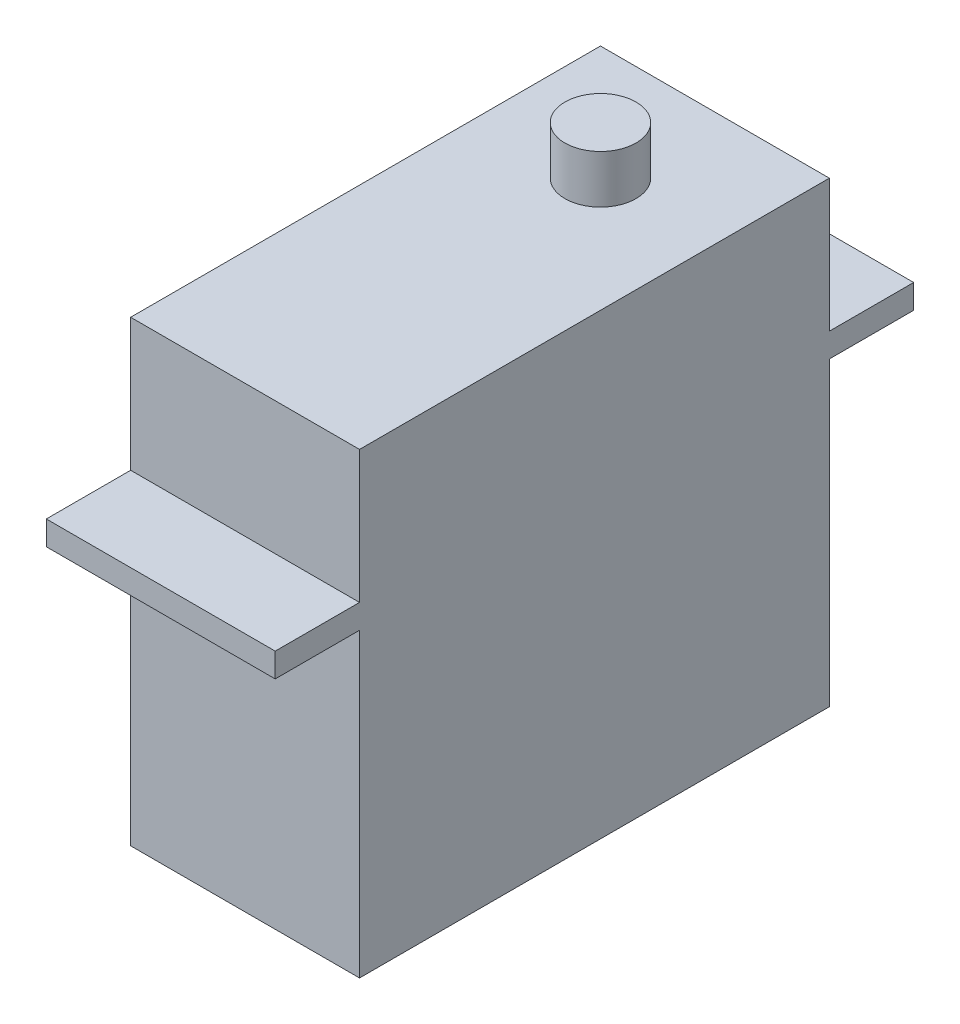
ISO-10303-21;
HEADER;
FILE_DESCRIPTION(('STEP AP214'),'2;1');
FILE_NAME('part.step','',(''),(''),'','','');
FILE_SCHEMA(('AUTOMOTIVE_DESIGN { 1 0 10303 214 1 1 1 1 }'));
ENDSEC;
DATA;
#1=APPLICATION_CONTEXT('core data for automotive mechanical design processes');
#2=APPLICATION_PROTOCOL_DEFINITION('international standard','automotive_design',2000,#1);
#3=PRODUCT_CONTEXT('',#1,'mechanical');
#4=PRODUCT('Part','Part','',(#3));
#5=PRODUCT_RELATED_PRODUCT_CATEGORY('part','',(#4));
#6=PRODUCT_DEFINITION_FORMATION('','',#4);
#7=PRODUCT_DEFINITION_CONTEXT('part definition',#1,'design');
#8=PRODUCT_DEFINITION('design','',#6,#7);
#9=PRODUCT_DEFINITION_SHAPE('','',#8);
#10=(LENGTH_UNIT() NAMED_UNIT(*) SI_UNIT(.MILLI.,.METRE.));
#11=(NAMED_UNIT(*) PLANE_ANGLE_UNIT() SI_UNIT($,.RADIAN.));
#12=(NAMED_UNIT(*) SI_UNIT($,.STERADIAN.) SOLID_ANGLE_UNIT());
#13=UNCERTAINTY_MEASURE_WITH_UNIT(LENGTH_MEASURE(1.E-05),#10,'distance_accuracy_value','');
#14=(GEOMETRIC_REPRESENTATION_CONTEXT(3) GLOBAL_UNCERTAINTY_ASSIGNED_CONTEXT((#13)) GLOBAL_UNIT_ASSIGNED_CONTEXT((#10,
#11,#12)) REPRESENTATION_CONTEXT('',''));
#15=CARTESIAN_POINT('',(0.,0.,0.));
#16=DIRECTION('',(0.,0.,1.));
#17=DIRECTION('',(1.,0.,0.));
#18=AXIS2_PLACEMENT_3D('',#15,#16,#17);
#19=CARTESIAN_POINT('',(0.,38.,-39.));
#20=DIRECTION('',(0.,0.,1.));
#21=DIRECTION('',(1.,0.,0.));
#22=AXIS2_PLACEMENT_3D('',#19,#20,#21);
#23=PLANE('',#22);
#24=DIRECTION('',(0.,-1.,0.));
#25=VECTOR('',#24,1.);
#26=CARTESIAN_POINT('',(0.,38.,-39.));
#27=LINE('',#26,#25);
#28=CARTESIAN_POINT('',(0.,38.,-39.));
#29=VERTEX_POINT('',#28);
#30=CARTESIAN_POINT('',(0.,27.,-39.));
#31=VERTEX_POINT('',#30);
#32=EDGE_CURVE('E217',#29,#31,#27,.T.);
#33=ORIENTED_EDGE('',*,*,#32,.T.);
#34=DIRECTION('',(-1.,0.,0.));
#35=VECTOR('',#34,1.);
#36=CARTESIAN_POINT('',(0.,27.,-39.));
#37=LINE('',#36,#35);
#38=CARTESIAN_POINT('',(-19.,27.,-39.));
#39=VERTEX_POINT('',#38);
#40=EDGE_CURVE('E182',#31,#39,#37,.T.);
#41=ORIENTED_EDGE('',*,*,#40,.T.);
#42=DIRECTION('',(0.,-1.,0.));
#43=VECTOR('',#42,1.);
#44=CARTESIAN_POINT('',(-19.,38.,-39.));
#45=LINE('',#44,#43);
#46=CARTESIAN_POINT('',(-19.,38.,-39.));
#47=VERTEX_POINT('',#46);
#48=EDGE_CURVE('E214',#47,#39,#45,.T.);
#49=ORIENTED_EDGE('',*,*,#48,.F.);
#50=DIRECTION('',(-1.,0.,0.));
#51=VECTOR('',#50,1.);
#52=CARTESIAN_POINT('',(0.,38.,-39.));
#53=LINE('',#52,#51);
#54=EDGE_CURVE('E189',#29,#47,#53,.T.);
#55=ORIENTED_EDGE('',*,*,#54,.F.);
#56=EDGE_LOOP('',(#33,#41,#49,#55));
#57=FACE_BOUND('',#56,.T.);
#58=ADVANCED_FACE('F41',(#57),#23,.F.);
#59=CARTESIAN_POINT('',(0.,38.,0.));
#60=DIRECTION('',(0.,0.,-1.));
#61=DIRECTION('',(-1.,0.,0.));
#62=AXIS2_PLACEMENT_3D('',#59,#60,#61);
#63=PLANE('',#62);
#64=DIRECTION('',(0.,-1.,0.));
#65=VECTOR('',#64,1.);
#66=CARTESIAN_POINT('',(-19.,38.,0.));
#67=LINE('',#66,#65);
#68=CARTESIAN_POINT('',(-19.,38.,0.));
#69=VERTEX_POINT('',#68);
#70=CARTESIAN_POINT('',(-19.,27.,0.));
#71=VERTEX_POINT('',#70);
#72=EDGE_CURVE('E210',#69,#71,#67,.T.);
#73=ORIENTED_EDGE('',*,*,#72,.T.);
#74=DIRECTION('',(1.,0.,0.));
#75=VECTOR('',#74,1.);
#76=CARTESIAN_POINT('',(0.,27.,0.));
#77=LINE('',#76,#75);
#78=CARTESIAN_POINT('',(0.,27.,0.));
#79=VERTEX_POINT('',#78);
#80=EDGE_CURVE('E11',#71,#79,#77,.T.);
#81=ORIENTED_EDGE('',*,*,#80,.T.);
#82=DIRECTION('',(0.,-1.,0.));
#83=VECTOR('',#82,1.);
#84=CARTESIAN_POINT('',(0.,38.,0.));
#85=LINE('',#84,#83);
#86=CARTESIAN_POINT('',(0.,38.,0.));
#87=VERTEX_POINT('',#86);
#88=EDGE_CURVE('E206',#87,#79,#85,.T.);
#89=ORIENTED_EDGE('',*,*,#88,.F.);
#90=DIRECTION('',(1.,0.,0.));
#91=VECTOR('',#90,1.);
#92=CARTESIAN_POINT('',(0.,38.,0.));
#93=LINE('',#92,#91);
#94=EDGE_CURVE('E194',#69,#87,#93,.T.);
#95=ORIENTED_EDGE('',*,*,#94,.F.);
#96=EDGE_LOOP('',(#73,#81,#89,#95));
#97=FACE_BOUND('',#96,.T.);
#98=ADVANCED_FACE('F244',(#97),#63,.F.);
#99=CARTESIAN_POINT('',(0.,38.,0.));
#100=DIRECTION('',(-1.,0.,0.));
#101=DIRECTION('',(0.,0.,1.));
#102=AXIS2_PLACEMENT_3D('',#99,#100,#101);
#103=PLANE('',#102);
#104=CARTESIAN_POINT('',(0.,25.,-39.));
#105=VERTEX_POINT('',#104);
#106=CARTESIAN_POINT('',(0.,0.,-39.));
#107=VERTEX_POINT('',#106);
#108=EDGE_CURVE('E134',#105,#107,#27,.T.);
#109=ORIENTED_EDGE('',*,*,#108,.F.);
#110=DIRECTION('',(0.,0.,-1.));
#111=VECTOR('',#110,1.);
#112=CARTESIAN_POINT('',(0.,25.,7.));
#113=LINE('',#112,#111);
#114=CARTESIAN_POINT('',(0.,25.,-46.));
#115=VERTEX_POINT('',#114);
#116=EDGE_CURVE('E56',#105,#115,#113,.T.);
#117=ORIENTED_EDGE('',*,*,#116,.T.);
#118=DIRECTION('',(0.,-1.,0.));
#119=VECTOR('',#118,1.);
#120=CARTESIAN_POINT('',(0.,27.,-46.));
#121=LINE('',#120,#119);
#122=CARTESIAN_POINT('',(0.,27.,-46.));
#123=VERTEX_POINT('',#122);
#124=EDGE_CURVE('E132',#123,#115,#121,.T.);
#125=ORIENTED_EDGE('',*,*,#124,.F.);
#126=DIRECTION('',(0.,0.,-1.));
#127=VECTOR('',#126,1.);
#128=CARTESIAN_POINT('',(0.,27.,7.));
#129=LINE('',#128,#127);
#130=EDGE_CURVE('E174',#31,#123,#129,.T.);
#131=ORIENTED_EDGE('',*,*,#130,.F.);
#132=ORIENTED_EDGE('',*,*,#32,.F.);
#133=DIRECTION('',(0.,0.,-1.));
#134=VECTOR('',#133,1.);
#135=CARTESIAN_POINT('',(0.,38.,0.));
#136=LINE('',#135,#134);
#137=EDGE_CURVE('E186',#87,#29,#136,.T.);
#138=ORIENTED_EDGE('',*,*,#137,.F.);
#139=ORIENTED_EDGE('',*,*,#88,.T.);
#140=CARTESIAN_POINT('',(0.,27.,7.));
#141=VERTEX_POINT('',#140);
#142=EDGE_CURVE('E171',#141,#79,#129,.T.);
#143=ORIENTED_EDGE('',*,*,#142,.F.);
#144=DIRECTION('',(0.,-1.,0.));
#145=VECTOR('',#144,1.);
#146=CARTESIAN_POINT('',(0.,27.,7.));
#147=LINE('',#146,#145);
#148=CARTESIAN_POINT('',(0.,25.,7.));
#149=VERTEX_POINT('',#148);
#150=EDGE_CURVE('E161',#141,#149,#147,.T.);
#151=ORIENTED_EDGE('',*,*,#150,.T.);
#152=CARTESIAN_POINT('',(0.,25.,0.));
#153=VERTEX_POINT('',#152);
#154=EDGE_CURVE('E135',#149,#153,#113,.T.);
#155=ORIENTED_EDGE('',*,*,#154,.T.);
#156=CARTESIAN_POINT('',(0.,0.,0.));
#157=VERTEX_POINT('',#156);
#158=EDGE_CURVE('E196',#153,#157,#85,.T.);
#159=ORIENTED_EDGE('',*,*,#158,.T.);
#160=DIRECTION('',(0.,0.,-1.));
#161=VECTOR('',#160,1.);
#162=CARTESIAN_POINT('',(0.,0.,0.));
#163=LINE('',#162,#161);
#164=EDGE_CURVE('E185',#157,#107,#163,.T.);
#165=ORIENTED_EDGE('',*,*,#164,.T.);
#166=EDGE_LOOP('',(#109,#117,#125,#131,#132,#138,#139,#143,#151,#155,#159,#165));
#167=FACE_BOUND('',#166,.T.);
#168=ADVANCED_FACE('F43',(#167),#103,.F.);
#169=CARTESIAN_POINT('',(-19.,25.,-39.));
#170=VERTEX_POINT('',#169);
#171=CARTESIAN_POINT('',(-19.,0.,-39.));
#172=VERTEX_POINT('',#171);
#173=EDGE_CURVE('E213',#170,#172,#45,.T.);
#174=ORIENTED_EDGE('',*,*,#173,.F.);
#175=DIRECTION('',(1.,0.,0.));
#176=VECTOR('',#175,1.);
#177=CARTESIAN_POINT('',(0.,25.,-39.));
#178=LINE('',#177,#176);
#179=EDGE_CURVE('E173',#170,#105,#178,.T.);
#180=ORIENTED_EDGE('',*,*,#179,.T.);
#181=ORIENTED_EDGE('',*,*,#108,.T.);
#182=DIRECTION('',(-1.,0.,0.));
#183=VECTOR('',#182,1.);
#184=CARTESIAN_POINT('',(0.,0.,-39.));
#185=LINE('',#184,#183);
#186=EDGE_CURVE('E198',#107,#172,#185,.T.);
#187=ORIENTED_EDGE('',*,*,#186,.T.);
#188=EDGE_LOOP('',(#174,#180,#181,#187));
#189=FACE_BOUND('',#188,.T.);
#190=ADVANCED_FACE('F264',(#189),#23,.F.);
#191=CARTESIAN_POINT('',(-19.,38.,0.));
#192=DIRECTION('',(1.,0.,0.));
#193=DIRECTION('',(0.,0.,-1.));
#194=AXIS2_PLACEMENT_3D('',#191,#192,#193);
#195=PLANE('',#194);
#196=CARTESIAN_POINT('',(-19.,25.,0.));
#197=VERTEX_POINT('',#196);
#198=CARTESIAN_POINT('',(-19.,0.,0.));
#199=VERTEX_POINT('',#198);
#200=EDGE_CURVE('E209',#197,#199,#67,.T.);
#201=ORIENTED_EDGE('',*,*,#200,.F.);
#202=DIRECTION('',(0.,0.,-1.));
#203=VECTOR('',#202,1.);
#204=CARTESIAN_POINT('',(-19.,25.,7.));
#205=LINE('',#204,#203);
#206=CARTESIAN_POINT('',(-19.,25.,7.));
#207=VERTEX_POINT('',#206);
#208=EDGE_CURVE('E64',#207,#197,#205,.T.);
#209=ORIENTED_EDGE('',*,*,#208,.F.);
#210=DIRECTION('',(0.,1.,0.));
#211=VECTOR('',#210,1.);
#212=CARTESIAN_POINT('',(-19.,27.,7.));
#213=LINE('',#212,#211);
#214=CARTESIAN_POINT('',(-19.,27.,7.));
#215=VERTEX_POINT('',#214);
#216=EDGE_CURVE('E166',#207,#215,#213,.T.);
#217=ORIENTED_EDGE('',*,*,#216,.T.);
#218=DIRECTION('',(0.,0.,-1.));
#219=VECTOR('',#218,1.);
#220=CARTESIAN_POINT('',(-19.,27.,7.));
#221=LINE('',#220,#219);
#222=EDGE_CURVE('E175',#215,#71,#221,.T.);
#223=ORIENTED_EDGE('',*,*,#222,.T.);
#224=ORIENTED_EDGE('',*,*,#72,.F.);
#225=DIRECTION('',(0.,0.,1.));
#226=VECTOR('',#225,1.);
#227=CARTESIAN_POINT('',(-19.,38.,0.));
#228=LINE('',#227,#226);
#229=EDGE_CURVE('E192',#47,#69,#228,.T.);
#230=ORIENTED_EDGE('',*,*,#229,.F.);
#231=ORIENTED_EDGE('',*,*,#48,.T.);
#232=CARTESIAN_POINT('',(-19.,27.,-46.));
#233=VERTEX_POINT('',#232);
#234=EDGE_CURVE('E178',#39,#233,#221,.T.);
#235=ORIENTED_EDGE('',*,*,#234,.T.);
#236=DIRECTION('',(0.,1.,0.));
#237=VECTOR('',#236,1.);
#238=CARTESIAN_POINT('',(-19.,27.,-46.));
#239=LINE('',#238,#237);
#240=CARTESIAN_POINT('',(-19.,25.,-46.));
#241=VERTEX_POINT('',#240);
#242=EDGE_CURVE('E146',#241,#233,#239,.T.);
#243=ORIENTED_EDGE('',*,*,#242,.F.);
#244=EDGE_CURVE('E142',#170,#241,#205,.T.);
#245=ORIENTED_EDGE('',*,*,#244,.F.);
#246=ORIENTED_EDGE('',*,*,#173,.T.);
#247=DIRECTION('',(0.,0.,1.));
#248=VECTOR('',#247,1.);
#249=CARTESIAN_POINT('',(-19.,0.,0.));
#250=LINE('',#249,#248);
#251=EDGE_CURVE('E201',#172,#199,#250,.T.);
#252=ORIENTED_EDGE('',*,*,#251,.T.);
#253=EDGE_LOOP('',(#201,#209,#217,#223,#224,#230,#231,#235,#243,#245,#246,#252));
#254=FACE_BOUND('',#253,.T.);
#255=ADVANCED_FACE('F224',(#254),#195,.F.);
#256=ORIENTED_EDGE('',*,*,#158,.F.);
#257=DIRECTION('',(-1.,0.,0.));
#258=VECTOR('',#257,1.);
#259=CARTESIAN_POINT('',(0.,25.,0.));
#260=LINE('',#259,#258);
#261=EDGE_CURVE('E49',#153,#197,#260,.T.);
#262=ORIENTED_EDGE('',*,*,#261,.T.);
#263=ORIENTED_EDGE('',*,*,#200,.T.);
#264=DIRECTION('',(1.,0.,0.));
#265=VECTOR('',#264,1.);
#266=CARTESIAN_POINT('',(0.,0.,0.));
#267=LINE('',#266,#265);
#268=EDGE_CURVE('E190',#199,#157,#267,.T.);
#269=ORIENTED_EDGE('',*,*,#268,.T.);
#270=EDGE_LOOP('',(#256,#262,#263,#269));
#271=FACE_BOUND('',#270,.T.);
#272=ADVANCED_FACE('F222',(#271),#63,.F.);
#273=CARTESIAN_POINT('',(0.,38.,0.));
#274=DIRECTION('',(0.,1.,0.));
#275=DIRECTION('',(0.,0.,1.));
#276=AXIS2_PLACEMENT_3D('',#273,#274,#275);
#277=PLANE('',#276);
#278=CARTESIAN_POINT('',(-9.5,38.,-29.5));
#279=DIRECTION('',(0.,1.,0.));
#280=DIRECTION('',(0.,0.,1.));
#281=AXIS2_PLACEMENT_3D('',#278,#279,#280);
#282=CIRCLE('',#281,2.95);
#283=CARTESIAN_POINT('',(-9.5,38.,-26.55));
#284=VERTEX_POINT('',#283);
#285=EDGE_CURVE('E155',#284,#284,#282,.T.);
#286=ORIENTED_EDGE('',*,*,#285,.F.);
#287=EDGE_LOOP('',(#286));
#288=FACE_BOUND('',#287,.T.);
#289=ORIENTED_EDGE('',*,*,#137,.T.);
#290=ORIENTED_EDGE('',*,*,#54,.T.);
#291=ORIENTED_EDGE('',*,*,#229,.T.);
#292=ORIENTED_EDGE('',*,*,#94,.T.);
#293=EDGE_LOOP('',(#289,#290,#291,#292));
#294=FACE_BOUND('',#293,.T.);
#295=ADVANCED_FACE('F248',(#288,#294),#277,.T.);
#296=CARTESIAN_POINT('',(0.,0.,0.));
#297=DIRECTION('',(0.,1.,0.));
#298=DIRECTION('',(0.,0.,1.));
#299=AXIS2_PLACEMENT_3D('',#296,#297,#298);
#300=PLANE('',#299);
#301=ORIENTED_EDGE('',*,*,#164,.F.);
#302=ORIENTED_EDGE('',*,*,#268,.F.);
#303=ORIENTED_EDGE('',*,*,#251,.F.);
#304=ORIENTED_EDGE('',*,*,#186,.F.);
#305=EDGE_LOOP('',(#301,#302,#303,#304));
#306=FACE_BOUND('',#305,.T.);
#307=ADVANCED_FACE('F232',(#306),#300,.F.);
#308=CARTESIAN_POINT('',(0.,0.,7.));
#309=DIRECTION('',(0.,0.,-1.));
#310=DIRECTION('',(-1.,0.,0.));
#311=AXIS2_PLACEMENT_3D('',#308,#309,#310);
#312=PLANE('',#311);
#313=ORIENTED_EDGE('',*,*,#150,.F.);
#314=DIRECTION('',(1.,0.,0.));
#315=VECTOR('',#314,1.);
#316=CARTESIAN_POINT('',(0.,27.,7.));
#317=LINE('',#316,#315);
#318=EDGE_CURVE('E136',#215,#141,#317,.T.);
#319=ORIENTED_EDGE('',*,*,#318,.F.);
#320=ORIENTED_EDGE('',*,*,#216,.F.);
#321=DIRECTION('',(-1.,0.,0.));
#322=VECTOR('',#321,1.);
#323=CARTESIAN_POINT('',(0.,25.,7.));
#324=LINE('',#323,#322);
#325=EDGE_CURVE('E164',#149,#207,#324,.T.);
#326=ORIENTED_EDGE('',*,*,#325,.F.);
#327=EDGE_LOOP('',(#313,#319,#320,#326));
#328=FACE_BOUND('',#327,.T.);
#329=ADVANCED_FACE('F237',(#328),#312,.F.);
#330=CARTESIAN_POINT('',(0.,25.,7.));
#331=DIRECTION('',(0.,-1.,0.));
#332=DIRECTION('',(0.,0.,-1.));
#333=AXIS2_PLACEMENT_3D('',#330,#331,#332);
#334=PLANE('',#333);
#335=ORIENTED_EDGE('',*,*,#261,.F.);
#336=ORIENTED_EDGE('',*,*,#154,.F.);
#337=ORIENTED_EDGE('',*,*,#325,.T.);
#338=ORIENTED_EDGE('',*,*,#208,.T.);
#339=EDGE_LOOP('',(#335,#336,#337,#338));
#340=FACE_BOUND('',#339,.T.);
#341=ADVANCED_FACE('F235',(#340),#334,.T.);
#342=CARTESIAN_POINT('',(0.,27.,7.));
#343=DIRECTION('',(0.,1.,0.));
#344=DIRECTION('',(-1.,0.,0.));
#345=AXIS2_PLACEMENT_3D('',#342,#343,#344);
#346=PLANE('',#345);
#347=ORIENTED_EDGE('',*,*,#80,.F.);
#348=ORIENTED_EDGE('',*,*,#222,.F.);
#349=ORIENTED_EDGE('',*,*,#318,.T.);
#350=ORIENTED_EDGE('',*,*,#142,.T.);
#351=EDGE_LOOP('',(#347,#348,#349,#350));
#352=FACE_BOUND('',#351,.T.);
#353=ADVANCED_FACE('F254',(#352),#346,.T.);
#354=ORIENTED_EDGE('',*,*,#40,.F.);
#355=ORIENTED_EDGE('',*,*,#130,.T.);
#356=DIRECTION('',(1.,0.,0.));
#357=VECTOR('',#356,1.);
#358=CARTESIAN_POINT('',(0.,27.,-46.));
#359=LINE('',#358,#357);
#360=EDGE_CURVE('E151',#233,#123,#359,.T.);
#361=ORIENTED_EDGE('',*,*,#360,.F.);
#362=ORIENTED_EDGE('',*,*,#234,.F.);
#363=EDGE_LOOP('',(#354,#355,#361,#362));
#364=FACE_BOUND('',#363,.T.);
#365=ADVANCED_FACE('F253',(#364),#346,.T.);
#366=ORIENTED_EDGE('',*,*,#179,.F.);
#367=ORIENTED_EDGE('',*,*,#244,.T.);
#368=DIRECTION('',(-1.,0.,0.));
#369=VECTOR('',#368,1.);
#370=CARTESIAN_POINT('',(0.,25.,-46.));
#371=LINE('',#370,#369);
#372=EDGE_CURVE('E139',#115,#241,#371,.T.);
#373=ORIENTED_EDGE('',*,*,#372,.F.);
#374=ORIENTED_EDGE('',*,*,#116,.F.);
#375=EDGE_LOOP('',(#366,#367,#373,#374));
#376=FACE_BOUND('',#375,.T.);
#377=ADVANCED_FACE('F140',(#376),#334,.T.);
#378=CARTESIAN_POINT('',(0.,0.,-46.));
#379=DIRECTION('',(0.,0.,-1.));
#380=DIRECTION('',(-1.,0.,0.));
#381=AXIS2_PLACEMENT_3D('',#378,#379,#380);
#382=PLANE('',#381);
#383=ORIENTED_EDGE('',*,*,#124,.T.);
#384=ORIENTED_EDGE('',*,*,#372,.T.);
#385=ORIENTED_EDGE('',*,*,#242,.T.);
#386=ORIENTED_EDGE('',*,*,#360,.T.);
#387=EDGE_LOOP('',(#383,#384,#385,#386));
#388=FACE_BOUND('',#387,.T.);
#389=ADVANCED_FACE('F149',(#388),#382,.T.);
#390=CARTESIAN_POINT('',(-9.5,42.,-29.5));
#391=DIRECTION('',(0.,-1.,0.));
#392=DIRECTION('',(0.,0.,-1.));
#393=AXIS2_PLACEMENT_3D('',#390,#391,#392);
#394=CYLINDRICAL_SURFACE('',#393,2.95);
#395=CARTESIAN_POINT('',(-9.5,42.,-29.5));
#396=DIRECTION('',(0.,1.,0.));
#397=DIRECTION('',(0.,0.,1.));
#398=AXIS2_PLACEMENT_3D('',#395,#396,#397);
#399=CIRCLE('',#398,2.95);
#400=CARTESIAN_POINT('',(-9.5,42.,-26.55));
#401=VERTEX_POINT('',#400);
#402=EDGE_CURVE('E152',#401,#401,#399,.T.);
#403=ORIENTED_EDGE('',*,*,#402,.F.);
#404=EDGE_LOOP('',(#403));
#405=FACE_BOUND('',#404,.T.);
#406=ORIENTED_EDGE('',*,*,#285,.T.);
#407=EDGE_LOOP('',(#406));
#408=FACE_BOUND('',#407,.T.);
#409=ADVANCED_FACE('F342',(#405,#408),#394,.T.);
#410=CARTESIAN_POINT('',(-9.5,42.,-29.5));
#411=DIRECTION('',(0.,1.,0.));
#412=DIRECTION('',(0.,0.,1.));
#413=AXIS2_PLACEMENT_3D('',#410,#411,#412);
#414=PLANE('',#413);
#415=ORIENTED_EDGE('',*,*,#402,.T.);
#416=EDGE_LOOP('',(#415));
#417=FACE_BOUND('',#416,.T.);
#418=ADVANCED_FACE('F360',(#417),#414,.T.);
#419=CLOSED_SHELL('',(#58,#98,#168,#190,#255,#272,#295,#307,#329,#341,#353,#365,#377,#389,#409,#418));
#420=MANIFOLD_SOLID_BREP('B2',#419);
#421=ADVANCED_BREP_SHAPE_REPRESENTATION('',(#18,#420),#14);
#422=SHAPE_DEFINITION_REPRESENTATION(#9,#421);
ENDSEC;
END-ISO-10303-21;
